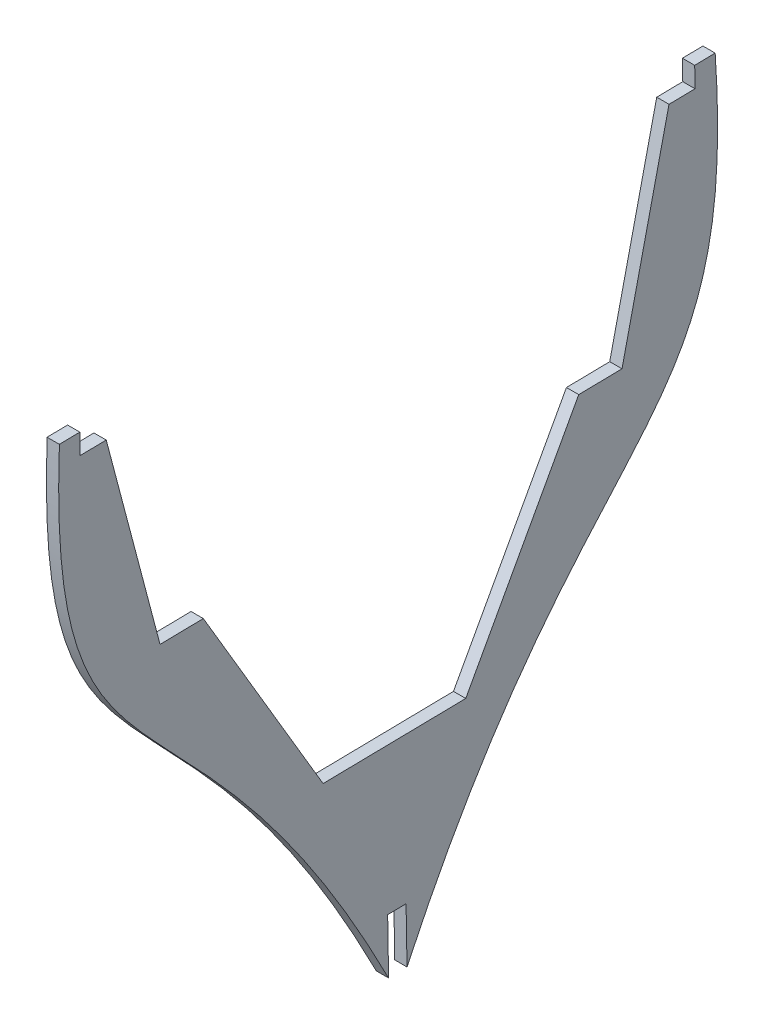
ISO-10303-21;
HEADER;
FILE_DESCRIPTION(('STEP AP214'),'2;1');
FILE_NAME('part.step','',(''),(''),'','','');
FILE_SCHEMA(('AUTOMOTIVE_DESIGN { 1 0 10303 214 1 1 1 1 }'));
ENDSEC;
DATA;
#1=APPLICATION_CONTEXT('core data for automotive mechanical design processes');
#2=APPLICATION_PROTOCOL_DEFINITION('international standard','automotive_design',2000,#1);
#3=PRODUCT_CONTEXT('',#1,'mechanical');
#4=PRODUCT('Part','Part','',(#3));
#5=PRODUCT_RELATED_PRODUCT_CATEGORY('part','',(#4));
#6=PRODUCT_DEFINITION_FORMATION('','',#4);
#7=PRODUCT_DEFINITION_CONTEXT('part definition',#1,'design');
#8=PRODUCT_DEFINITION('design','',#6,#7);
#9=PRODUCT_DEFINITION_SHAPE('','',#8);
#10=(LENGTH_UNIT() NAMED_UNIT(*) SI_UNIT(.MILLI.,.METRE.));
#11=(NAMED_UNIT(*) PLANE_ANGLE_UNIT() SI_UNIT($,.RADIAN.));
#12=(NAMED_UNIT(*) SI_UNIT($,.STERADIAN.) SOLID_ANGLE_UNIT());
#13=UNCERTAINTY_MEASURE_WITH_UNIT(LENGTH_MEASURE(1.E-05),#10,'distance_accuracy_value','');
#14=(GEOMETRIC_REPRESENTATION_CONTEXT(3) GLOBAL_UNCERTAINTY_ASSIGNED_CONTEXT((#13)) GLOBAL_UNIT_ASSIGNED_CONTEXT((#10,
#11,#12)) REPRESENTATION_CONTEXT('',''));
#15=CARTESIAN_POINT('',(0.,0.,0.));
#16=DIRECTION('',(0.,0.,1.));
#17=DIRECTION('',(1.,0.,0.));
#18=AXIS2_PLACEMENT_3D('',#15,#16,#17);
#19=CARTESIAN_POINT('',(6.,350.659764397002,166.024970344969));
#20=CARTESIAN_POINT('',(6.,182.415272885809,171.970871960082));
#21=CARTESIAN_POINT('',(6.,237.281542498073,100.687923251235));
#22=CARTESIAN_POINT('',(6.,35.2838539573811,0.586889824517354));
#23=B_SPLINE_CURVE_WITH_KNOTS('',3,(#19,#20,#21,#22),.UNSPECIFIED.,.F.,.F.,(4,4),(0.,1.),.UNSPECIFIED.);
#24=DIRECTION('',(-1.,0.,0.));
#25=VECTOR('',#24,1.);
#26=SURFACE_OF_LINEAR_EXTRUSION('',#23,#25);
#27=CARTESIAN_POINT('',(0.,350.659764397002,166.024970344969));
#28=CARTESIAN_POINT('',(0.,182.415272885809,171.970871960082));
#29=CARTESIAN_POINT('',(0.,237.281542498073,100.687923251235));
#30=CARTESIAN_POINT('',(0.,35.2838539573811,0.586889824517354));
#31=B_SPLINE_CURVE_WITH_KNOTS('',3,(#27,#28,#29,#30),.UNSPECIFIED.,.F.,.F.,(4,4),(0.,1.),.UNSPECIFIED.);
#32=CARTESIAN_POINT('',(0.,350.659764397002,166.024970344969));
#33=VERTEX_POINT('',#32);
#34=CARTESIAN_POINT('',(0.,44.5352413875151,5.24201669881402));
#35=VERTEX_POINT('',#34);
#36=EDGE_CURVE('E179',#33,#35,#31,.T.);
#37=ORIENTED_EDGE('',*,*,#36,.T.);
#38=DIRECTION('',(1.,0.,0.));
#39=VECTOR('',#38,1.);
#40=CARTESIAN_POINT('',(0.,44.5352413875151,5.24201669881402));
#41=LINE('',#40,#39);
#42=CARTESIAN_POINT('',(6.,44.5352413875151,5.24201669881402));
#43=VERTEX_POINT('',#42);
#44=EDGE_CURVE('E185',#35,#43,#41,.T.);
#45=ORIENTED_EDGE('',*,*,#44,.T.);
#46=CARTESIAN_POINT('',(6.,350.659764397002,166.024970344969));
#47=VERTEX_POINT('',#46);
#48=EDGE_CURVE('E219',#47,#43,#23,.T.);
#49=ORIENTED_EDGE('',*,*,#48,.F.);
#50=DIRECTION('',(-1.,0.,0.));
#51=VECTOR('',#50,1.);
#52=CARTESIAN_POINT('',(6.,350.659764397002,166.024970344969));
#53=LINE('',#52,#51);
#54=EDGE_CURVE('E175',#47,#33,#53,.T.);
#55=ORIENTED_EDGE('',*,*,#54,.T.);
#56=EDGE_LOOP('',(#37,#45,#49,#55));
#57=FACE_BOUND('',#56,.T.);
#58=ADVANCED_FACE('F33',(#57),#26,.F.);
#59=CARTESIAN_POINT('',(6.,35.2838539573811,0.586889824517354));
#60=CARTESIAN_POINT('',(6.,240.498916663988,-92.740818318363));
#61=CARTESIAN_POINT('',(6.,188.033695435773,-165.80905272476));
#62=CARTESIAN_POINT('',(6.,355.987370295187,-154.271038550099));
#63=B_SPLINE_CURVE_WITH_KNOTS('',3,(#59,#60,#61,#62),.UNSPECIFIED.,.F.,.F.,(4,4),(0.,1.),.UNSPECIFIED.);
#64=DIRECTION('',(-1.,0.,0.));
#65=VECTOR('',#64,1.);
#66=SURFACE_OF_LINEAR_EXTRUSION('',#63,#65);
#67=CARTESIAN_POINT('',(6.,44.6849418263344,-3.75798330118599));
#68=VERTEX_POINT('',#67);
#69=CARTESIAN_POINT('',(6.,355.987370295187,-154.271038550099));
#70=VERTEX_POINT('',#69);
#71=EDGE_CURVE('E116',#68,#70,#63,.T.);
#72=ORIENTED_EDGE('',*,*,#71,.F.);
#73=DIRECTION('',(1.,0.,0.));
#74=VECTOR('',#73,1.);
#75=CARTESIAN_POINT('',(0.,44.6849418263344,-3.75798330118599));
#76=LINE('',#75,#74);
#77=CARTESIAN_POINT('',(0.,44.6849418263344,-3.75798330118599));
#78=VERTEX_POINT('',#77);
#79=EDGE_CURVE('E311',#78,#68,#76,.T.);
#80=ORIENTED_EDGE('',*,*,#79,.F.);
#81=CARTESIAN_POINT('',(0.,35.2838539573811,0.586889824517354));
#82=CARTESIAN_POINT('',(0.,240.498916663988,-92.740818318363));
#83=CARTESIAN_POINT('',(0.,188.033695435773,-165.80905272476));
#84=CARTESIAN_POINT('',(0.,355.987370295187,-154.271038550099));
#85=B_SPLINE_CURVE_WITH_KNOTS('',3,(#81,#82,#83,#84),.UNSPECIFIED.,.F.,.F.,(4,4),(0.,1.),.UNSPECIFIED.);
#86=CARTESIAN_POINT('',(0.,355.987370295187,-154.271038550099));
#87=VERTEX_POINT('',#86);
#88=EDGE_CURVE('E184',#78,#87,#85,.T.);
#89=ORIENTED_EDGE('',*,*,#88,.T.);
#90=DIRECTION('',(-1.,0.,0.));
#91=VECTOR('',#90,1.);
#92=CARTESIAN_POINT('',(6.,355.987370295187,-154.271038550099));
#93=LINE('',#92,#91);
#94=EDGE_CURVE('E11',#70,#87,#93,.T.);
#95=ORIENTED_EDGE('',*,*,#94,.F.);
#96=EDGE_LOOP('',(#72,#80,#89,#95));
#97=FACE_BOUND('',#96,.T.);
#98=ADVANCED_FACE('F323',(#97),#66,.F.);
#99=CARTESIAN_POINT('',(6.,355.987370295187,-154.271038550099));
#100=DIRECTION('',(0.,-0.999861693998224,-0.0166310815944739));
#101=DIRECTION('',(0.,0.0166310815944739,-0.999861693998224));
#102=AXIS2_PLACEMENT_3D('',#99,#100,#101);
#103=PLANE('',#102);
#104=DIRECTION('',(0.,-0.0166310815944739,0.999861693998224));
#105=VECTOR('',#104,1.);
#106=CARTESIAN_POINT('',(0.,355.987370295187,-154.271038550099));
#107=LINE('',#106,#105);
#108=CARTESIAN_POINT('',(0.,355.821036474276,-144.271038550099));
#109=VERTEX_POINT('',#108);
#110=EDGE_CURVE('E192',#87,#109,#107,.T.);
#111=ORIENTED_EDGE('',*,*,#110,.T.);
#112=DIRECTION('',(-1.,0.,0.));
#113=VECTOR('',#112,1.);
#114=CARTESIAN_POINT('',(6.,355.821036474276,-144.271038550099));
#115=LINE('',#114,#113);
#116=CARTESIAN_POINT('',(6.,355.821036474276,-144.271038550099));
#117=VERTEX_POINT('',#116);
#118=EDGE_CURVE('E41',#117,#109,#115,.T.);
#119=ORIENTED_EDGE('',*,*,#118,.F.);
#120=DIRECTION('',(0.,-0.0166310815944739,0.999861693998224));
#121=VECTOR('',#120,1.);
#122=CARTESIAN_POINT('',(6.,355.987370295187,-154.271038550099));
#123=LINE('',#122,#121);
#124=EDGE_CURVE('E305',#70,#117,#123,.T.);
#125=ORIENTED_EDGE('',*,*,#124,.F.);
#126=ORIENTED_EDGE('',*,*,#94,.T.);
#127=EDGE_LOOP('',(#111,#119,#125,#126));
#128=FACE_BOUND('',#127,.T.);
#129=ADVANCED_FACE('F326',(#128),#103,.F.);
#130=CARTESIAN_POINT('',(6.,355.821036474276,-144.271038550099));
#131=DIRECTION('',(0.,0.0166310815944574,-0.999861693998224));
#132=DIRECTION('',(0.,0.999861693998224,0.0166310815944574));
#133=AXIS2_PLACEMENT_3D('',#130,#131,#132);
#134=PLANE('',#133);
#135=DIRECTION('',(0.,-0.999861693998224,-0.0166310815944574));
#136=VECTOR('',#135,1.);
#137=CARTESIAN_POINT('',(0.,355.821036474276,-144.271038550099));
#138=LINE('',#137,#136);
#139=CARTESIAN_POINT('',(0.,345.821036474277,-144.437372371009));
#140=VERTEX_POINT('',#139);
#141=EDGE_CURVE('E197',#109,#140,#138,.T.);
#142=ORIENTED_EDGE('',*,*,#141,.T.);
#143=DIRECTION('',(-1.,0.,0.));
#144=VECTOR('',#143,1.);
#145=CARTESIAN_POINT('',(6.,345.821036474277,-144.437372371009));
#146=LINE('',#145,#144);
#147=CARTESIAN_POINT('',(6.,345.821036474277,-144.437372371009));
#148=VERTEX_POINT('',#147);
#149=EDGE_CURVE('E244',#148,#140,#146,.T.);
#150=ORIENTED_EDGE('',*,*,#149,.F.);
#151=DIRECTION('',(0.,-0.999861693998224,-0.0166310815944574));
#152=VECTOR('',#151,1.);
#153=CARTESIAN_POINT('',(6.,355.821036474276,-144.271038550099));
#154=LINE('',#153,#152);
#155=EDGE_CURVE('E253',#117,#148,#154,.T.);
#156=ORIENTED_EDGE('',*,*,#155,.F.);
#157=ORIENTED_EDGE('',*,*,#118,.T.);
#158=EDGE_LOOP('',(#142,#150,#156,#157));
#159=FACE_BOUND('',#158,.T.);
#160=ADVANCED_FACE('F251',(#159),#134,.F.);
#161=CARTESIAN_POINT('',(6.,345.821036474277,-144.437372371009));
#162=DIRECTION('',(0.,-0.999861693998224,-0.0166310815944618));
#163=DIRECTION('',(0.,0.0166310815944618,-0.999861693998224));
#164=AXIS2_PLACEMENT_3D('',#161,#162,#163);
#165=PLANE('',#164);
#166=DIRECTION('',(0.,-0.0166310815944618,0.999861693998224));
#167=VECTOR('',#166,1.);
#168=CARTESIAN_POINT('',(0.,345.821036474277,-144.437372371009));
#169=LINE('',#168,#167);
#170=CARTESIAN_POINT('',(0.,345.60953200841,-131.72171029407));
#171=VERTEX_POINT('',#170);
#172=EDGE_CURVE('E199',#140,#171,#169,.T.);
#173=ORIENTED_EDGE('',*,*,#172,.T.);
#174=DIRECTION('',(-1.,0.,0.));
#175=VECTOR('',#174,1.);
#176=CARTESIAN_POINT('',(6.,345.60953200841,-131.72171029407));
#177=LINE('',#176,#175);
#178=CARTESIAN_POINT('',(6.,345.60953200841,-131.72171029407));
#179=VERTEX_POINT('',#178);
#180=EDGE_CURVE('E241',#179,#171,#177,.T.);
#181=ORIENTED_EDGE('',*,*,#180,.F.);
#182=DIRECTION('',(0.,-0.0166310815944618,0.999861693998224));
#183=VECTOR('',#182,1.);
#184=CARTESIAN_POINT('',(6.,345.821036474277,-144.437372371009));
#185=LINE('',#184,#183);
#186=EDGE_CURVE('E275',#148,#179,#185,.T.);
#187=ORIENTED_EDGE('',*,*,#186,.F.);
#188=ORIENTED_EDGE('',*,*,#149,.T.);
#189=EDGE_LOOP('',(#173,#181,#187,#188));
#190=FACE_BOUND('',#189,.T.);
#191=ADVANCED_FACE('F266',(#190),#165,.F.);
#192=CARTESIAN_POINT('',(6.,345.60953200841,-131.72171029407));
#193=DIRECTION('',(0.,-0.222907743790148,-0.974839544621773));
#194=DIRECTION('',(0.,0.974839544621773,-0.222907743790148));
#195=AXIS2_PLACEMENT_3D('',#192,#193,#194);
#196=PLANE('',#195);
#197=DIRECTION('',(0.,-0.974839544621773,0.222907743790148));
#198=VECTOR('',#197,1.);
#199=CARTESIAN_POINT('',(0.,345.60953200841,-131.72171029407));
#200=LINE('',#199,#198);
#201=CARTESIAN_POINT('',(0.,245.213854063886,-108.765138435284));
#202=VERTEX_POINT('',#201);
#203=EDGE_CURVE('E201',#171,#202,#200,.T.);
#204=ORIENTED_EDGE('',*,*,#203,.T.);
#205=DIRECTION('',(-1.,0.,0.));
#206=VECTOR('',#205,1.);
#207=CARTESIAN_POINT('',(6.,245.213854063886,-108.765138435284));
#208=LINE('',#207,#206);
#209=CARTESIAN_POINT('',(6.,245.213854063886,-108.765138435284));
#210=VERTEX_POINT('',#209);
#211=EDGE_CURVE('E238',#210,#202,#208,.T.);
#212=ORIENTED_EDGE('',*,*,#211,.F.);
#213=DIRECTION('',(0.,-0.974839544621773,0.222907743790148));
#214=VECTOR('',#213,1.);
#215=CARTESIAN_POINT('',(6.,345.60953200841,-131.72171029407));
#216=LINE('',#215,#214);
#217=EDGE_CURVE('E272',#179,#210,#216,.T.);
#218=ORIENTED_EDGE('',*,*,#217,.F.);
#219=ORIENTED_EDGE('',*,*,#180,.T.);
#220=EDGE_LOOP('',(#204,#212,#218,#219));
#221=FACE_BOUND('',#220,.T.);
#222=ADVANCED_FACE('F270',(#221),#196,.F.);
#223=CARTESIAN_POINT('',(6.,245.213854063886,-108.765138435284));
#224=DIRECTION('',(0.,-0.999861693998224,-0.0166310815944606));
#225=DIRECTION('',(0.,0.0166310815944606,-0.999861693998224));
#226=AXIS2_PLACEMENT_3D('',#223,#224,#225);
#227=PLANE('',#226);
#228=DIRECTION('',(0.,-0.0166310815944606,0.999861693998224));
#229=VECTOR('',#228,1.);
#230=CARTESIAN_POINT('',(0.,245.213854063886,-108.765138435284));
#231=LINE('',#230,#229);
#232=CARTESIAN_POINT('',(0.,244.86226254053,-87.6274334615373));
#233=VERTEX_POINT('',#232);
#234=EDGE_CURVE('E203',#202,#233,#231,.T.);
#235=ORIENTED_EDGE('',*,*,#234,.T.);
#236=DIRECTION('',(-1.,0.,0.));
#237=VECTOR('',#236,1.);
#238=CARTESIAN_POINT('',(6.,244.86226254053,-87.6274334615373));
#239=LINE('',#238,#237);
#240=CARTESIAN_POINT('',(6.,244.86226254053,-87.6274334615373));
#241=VERTEX_POINT('',#240);
#242=EDGE_CURVE('E235',#241,#233,#239,.T.);
#243=ORIENTED_EDGE('',*,*,#242,.F.);
#244=DIRECTION('',(0.,-0.0166310815944606,0.999861693998224));
#245=VECTOR('',#244,1.);
#246=CARTESIAN_POINT('',(6.,245.213854063886,-108.765138435284));
#247=LINE('',#246,#245);
#248=EDGE_CURVE('E274',#210,#241,#247,.T.);
#249=ORIENTED_EDGE('',*,*,#248,.F.);
#250=ORIENTED_EDGE('',*,*,#211,.T.);
#251=EDGE_LOOP('',(#235,#243,#249,#250));
#252=FACE_BOUND('',#251,.T.);
#253=ADVANCED_FACE('F336',(#252),#227,.F.);
#254=CARTESIAN_POINT('',(6.,244.86226254053,-87.6274334615373));
#255=DIRECTION('',(0.,-0.479673239748636,-0.877447196741233));
#256=DIRECTION('',(0.,0.877447196741233,-0.479673239748636));
#257=AXIS2_PLACEMENT_3D('',#254,#255,#256);
#258=PLANE('',#257);
#259=DIRECTION('',(0.,-0.877447196741233,0.479673239748636));
#260=VECTOR('',#259,1.);
#261=CARTESIAN_POINT('',(0.,244.86226254053,-87.6274334615373));
#262=LINE('',#261,#260);
#263=CARTESIAN_POINT('',(0.,143.930663492918,-32.4512504524804));
#264=VERTEX_POINT('',#263);
#265=EDGE_CURVE('E205',#233,#264,#262,.T.);
#266=ORIENTED_EDGE('',*,*,#265,.T.);
#267=DIRECTION('',(-1.,0.,0.));
#268=VECTOR('',#267,1.);
#269=CARTESIAN_POINT('',(6.,143.930663492918,-32.4512504524804));
#270=LINE('',#269,#268);
#271=CARTESIAN_POINT('',(6.,143.930663492918,-32.4512504524804));
#272=VERTEX_POINT('',#271);
#273=EDGE_CURVE('E232',#272,#264,#270,.T.);
#274=ORIENTED_EDGE('',*,*,#273,.F.);
#275=DIRECTION('',(0.,-0.877447196741233,0.479673239748636));
#276=VECTOR('',#275,1.);
#277=CARTESIAN_POINT('',(6.,244.86226254053,-87.6274334615373));
#278=LINE('',#277,#276);
#279=EDGE_CURVE('E277',#241,#272,#278,.T.);
#280=ORIENTED_EDGE('',*,*,#279,.F.);
#281=ORIENTED_EDGE('',*,*,#242,.T.);
#282=EDGE_LOOP('',(#266,#274,#280,#281));
#283=FACE_BOUND('',#282,.T.);
#284=ADVANCED_FACE('F339',(#283),#258,.F.);
#285=CARTESIAN_POINT('',(6.,142.771793599981,37.2200819677448));
#286=DIRECTION('',(0.,-0.999861693998224,-0.016631081594462));
#287=DIRECTION('',(0.,0.016631081594462,-0.999861693998224));
#288=AXIS2_PLACEMENT_3D('',#285,#286,#287);
#289=PLANE('',#288);
#290=DIRECTION('',(0.,-0.016631081594462,0.999861693998224));
#291=VECTOR('',#290,1.);
#292=CARTESIAN_POINT('',(0.,142.771793599981,37.2200819677448));
#293=LINE('',#292,#291);
#294=CARTESIAN_POINT('',(0.,142.771793599981,37.2200819677448));
#295=VERTEX_POINT('',#294);
#296=EDGE_CURVE('E207',#264,#295,#293,.T.);
#297=ORIENTED_EDGE('',*,*,#296,.T.);
#298=DIRECTION('',(-1.,0.,0.));
#299=VECTOR('',#298,1.);
#300=CARTESIAN_POINT('',(6.,142.771793599981,37.2200819677448));
#301=LINE('',#300,#299);
#302=CARTESIAN_POINT('',(6.,142.771793599981,37.2200819677448));
#303=VERTEX_POINT('',#302);
#304=EDGE_CURVE('E229',#303,#295,#301,.T.);
#305=ORIENTED_EDGE('',*,*,#304,.F.);
#306=DIRECTION('',(0.,-0.016631081594462,0.999861693998224));
#307=VECTOR('',#306,1.);
#308=CARTESIAN_POINT('',(6.,142.771793599981,37.2200819677448));
#309=LINE('',#308,#307);
#310=EDGE_CURVE('E283',#272,#303,#309,.T.);
#311=ORIENTED_EDGE('',*,*,#310,.F.);
#312=ORIENTED_EDGE('',*,*,#273,.T.);
#313=EDGE_LOOP('',(#297,#305,#311,#312));
#314=FACE_BOUND('',#313,.T.);
#315=ADVANCED_FACE('F343',(#314),#289,.F.);
#316=CARTESIAN_POINT('',(6.,241.812533352014,95.7224812956938));
#317=DIRECTION('',(0.,-0.508589646625238,0.861009042545788));
#318=DIRECTION('',(0.,-0.861009042545788,-0.508589646625238));
#319=AXIS2_PLACEMENT_3D('',#316,#317,#318);
#320=PLANE('',#319);
#321=DIRECTION('',(0.,0.861009042545788,0.508589646625238));
#322=VECTOR('',#321,1.);
#323=CARTESIAN_POINT('',(0.,241.812533352014,95.7224812956938));
#324=LINE('',#323,#322);
#325=CARTESIAN_POINT('',(0.,241.812533352014,95.7224812956938));
#326=VERTEX_POINT('',#325);
#327=EDGE_CURVE('E209',#295,#326,#324,.T.);
#328=ORIENTED_EDGE('',*,*,#327,.T.);
#329=DIRECTION('',(-1.,0.,0.));
#330=VECTOR('',#329,1.);
#331=CARTESIAN_POINT('',(6.,241.812533352014,95.7224812956938));
#332=LINE('',#331,#330);
#333=CARTESIAN_POINT('',(6.,241.812533352014,95.7224812956938));
#334=VERTEX_POINT('',#333);
#335=EDGE_CURVE('E226',#334,#326,#332,.T.);
#336=ORIENTED_EDGE('',*,*,#335,.F.);
#337=DIRECTION('',(0.,0.861009042545788,0.508589646625238));
#338=VECTOR('',#337,1.);
#339=CARTESIAN_POINT('',(6.,241.812533352014,95.7224812956938));
#340=LINE('',#339,#338);
#341=EDGE_CURVE('E285',#303,#334,#340,.T.);
#342=ORIENTED_EDGE('',*,*,#341,.F.);
#343=ORIENTED_EDGE('',*,*,#304,.T.);
#344=EDGE_LOOP('',(#328,#336,#342,#343));
#345=FACE_BOUND('',#344,.T.);
#346=ADVANCED_FACE('F347',(#345),#320,.F.);
#347=CARTESIAN_POINT('',(6.,241.460941828658,116.860186269441));
#348=DIRECTION('',(0.,-0.999861693998224,-0.0166310815944606));
#349=DIRECTION('',(0.,0.0166310815944606,-0.999861693998224));
#350=AXIS2_PLACEMENT_3D('',#347,#348,#349);
#351=PLANE('',#350);
#352=DIRECTION('',(0.,-0.0166310815944606,0.999861693998224));
#353=VECTOR('',#352,1.);
#354=CARTESIAN_POINT('',(0.,241.460941828658,116.860186269441));
#355=LINE('',#354,#353);
#356=CARTESIAN_POINT('',(0.,241.460941828658,116.860186269441));
#357=VERTEX_POINT('',#356);
#358=EDGE_CURVE('E211',#326,#357,#355,.T.);
#359=ORIENTED_EDGE('',*,*,#358,.T.);
#360=DIRECTION('',(-1.,0.,0.));
#361=VECTOR('',#360,1.);
#362=CARTESIAN_POINT('',(6.,241.460941828658,116.860186269441));
#363=LINE('',#362,#361);
#364=CARTESIAN_POINT('',(6.,241.460941828658,116.860186269441));
#365=VERTEX_POINT('',#364);
#366=EDGE_CURVE('E223',#365,#357,#363,.T.);
#367=ORIENTED_EDGE('',*,*,#366,.F.);
#368=DIRECTION('',(0.,-0.0166310815944606,0.999861693998224));
#369=VECTOR('',#368,1.);
#370=CARTESIAN_POINT('',(6.,241.460941828658,116.860186269441));
#371=LINE('',#370,#369);
#372=EDGE_CURVE('E287',#334,#365,#371,.T.);
#373=ORIENTED_EDGE('',*,*,#372,.F.);
#374=ORIENTED_EDGE('',*,*,#335,.T.);
#375=EDGE_LOOP('',(#359,#367,#373,#374));
#376=FACE_BOUND('',#375,.T.);
#377=ADVANCED_FACE('F293',(#376),#351,.F.);
#378=CARTESIAN_POINT('',(6.,341.037602683778,143.142974447119));
#379=DIRECTION('',(0.,-0.255205221809213,0.966886908982281));
#380=DIRECTION('',(0.,-0.966886908982281,-0.255205221809213));
#381=AXIS2_PLACEMENT_3D('',#378,#379,#380);
#382=PLANE('',#381);
#383=DIRECTION('',(0.,0.966886908982281,0.255205221809213));
#384=VECTOR('',#383,1.);
#385=CARTESIAN_POINT('',(0.,341.037602683778,143.142974447119));
#386=LINE('',#385,#384);
#387=CARTESIAN_POINT('',(0.,341.037602683778,143.142974447119));
#388=VERTEX_POINT('',#387);
#389=EDGE_CURVE('E213',#357,#388,#386,.T.);
#390=ORIENTED_EDGE('',*,*,#389,.T.);
#391=DIRECTION('',(-1.,0.,0.));
#392=VECTOR('',#391,1.);
#393=CARTESIAN_POINT('',(6.,341.037602683778,143.142974447119));
#394=LINE('',#393,#392);
#395=CARTESIAN_POINT('',(6.,341.037602683778,143.142974447119));
#396=VERTEX_POINT('',#395);
#397=EDGE_CURVE('E170',#396,#388,#394,.T.);
#398=ORIENTED_EDGE('',*,*,#397,.F.);
#399=DIRECTION('',(0.,0.966886908982281,0.255205221809213));
#400=VECTOR('',#399,1.);
#401=CARTESIAN_POINT('',(6.,341.037602683778,143.142974447119));
#402=LINE('',#401,#400);
#403=EDGE_CURVE('E158',#365,#396,#402,.T.);
#404=ORIENTED_EDGE('',*,*,#403,.F.);
#405=ORIENTED_EDGE('',*,*,#366,.T.);
#406=EDGE_LOOP('',(#390,#398,#404,#405));
#407=FACE_BOUND('',#406,.T.);
#408=ADVANCED_FACE('F297',(#407),#382,.F.);
#409=CARTESIAN_POINT('',(6.,340.826098217912,155.858636524058));
#410=DIRECTION('',(0.,-0.999861693998224,-0.0166310815944618));
#411=DIRECTION('',(0.,0.0166310815944618,-0.999861693998224));
#412=AXIS2_PLACEMENT_3D('',#409,#410,#411);
#413=PLANE('',#412);
#414=DIRECTION('',(0.,-0.0166310815944618,0.999861693998224));
#415=VECTOR('',#414,1.);
#416=CARTESIAN_POINT('',(0.,340.826098217912,155.858636524058));
#417=LINE('',#416,#415);
#418=CARTESIAN_POINT('',(0.,340.826098217912,155.858636524058));
#419=VERTEX_POINT('',#418);
#420=EDGE_CURVE('E167',#388,#419,#417,.T.);
#421=ORIENTED_EDGE('',*,*,#420,.T.);
#422=DIRECTION('',(-1.,0.,0.));
#423=VECTOR('',#422,1.);
#424=CARTESIAN_POINT('',(6.,340.826098217912,155.858636524058));
#425=LINE('',#424,#423);
#426=CARTESIAN_POINT('',(6.,340.826098217912,155.858636524058));
#427=VERTEX_POINT('',#426);
#428=EDGE_CURVE('E164',#427,#419,#425,.T.);
#429=ORIENTED_EDGE('',*,*,#428,.F.);
#430=DIRECTION('',(0.,-0.0166310815944618,0.999861693998224));
#431=VECTOR('',#430,1.);
#432=CARTESIAN_POINT('',(6.,340.826098217912,155.858636524058));
#433=LINE('',#432,#431);
#434=EDGE_CURVE('E151',#396,#427,#433,.T.);
#435=ORIENTED_EDGE('',*,*,#434,.F.);
#436=ORIENTED_EDGE('',*,*,#397,.T.);
#437=EDGE_LOOP('',(#421,#429,#435,#436));
#438=FACE_BOUND('',#437,.T.);
#439=ADVANCED_FACE('F165',(#438),#413,.F.);
#440=CARTESIAN_POINT('',(6.,350.826098217912,156.024970344969));
#441=DIRECTION('',(0.,-0.0166310815944628,0.999861693998224));
#442=DIRECTION('',(0.,-0.999861693998224,-0.0166310815944628));
#443=AXIS2_PLACEMENT_3D('',#440,#441,#442);
#444=PLANE('',#443);
#445=DIRECTION('',(0.,0.999861693998224,0.0166310815944628));
#446=VECTOR('',#445,1.);
#447=CARTESIAN_POINT('',(0.,350.826098217912,156.024970344969));
#448=LINE('',#447,#446);
#449=CARTESIAN_POINT('',(0.,350.826098217912,156.024970344969));
#450=VERTEX_POINT('',#449);
#451=EDGE_CURVE('E216',#419,#450,#448,.T.);
#452=ORIENTED_EDGE('',*,*,#451,.T.);
#453=DIRECTION('',(-1.,0.,0.));
#454=VECTOR('',#453,1.);
#455=CARTESIAN_POINT('',(6.,350.826098217912,156.024970344969));
#456=LINE('',#455,#454);
#457=CARTESIAN_POINT('',(6.,350.826098217912,156.024970344969));
#458=VERTEX_POINT('',#457);
#459=EDGE_CURVE('E171',#458,#450,#456,.T.);
#460=ORIENTED_EDGE('',*,*,#459,.F.);
#461=DIRECTION('',(0.,0.999861693998224,0.0166310815944628));
#462=VECTOR('',#461,1.);
#463=CARTESIAN_POINT('',(6.,350.826098217912,156.024970344969));
#464=LINE('',#463,#462);
#465=EDGE_CURVE('E155',#427,#458,#464,.T.);
#466=ORIENTED_EDGE('',*,*,#465,.F.);
#467=ORIENTED_EDGE('',*,*,#428,.T.);
#468=EDGE_LOOP('',(#452,#460,#466,#467));
#469=FACE_BOUND('',#468,.T.);
#470=ADVANCED_FACE('F173',(#469),#444,.F.);
#471=CARTESIAN_POINT('',(6.,350.659764397002,166.024970344969));
#472=DIRECTION('',(0.,-0.999861693998224,-0.0166310815944628));
#473=DIRECTION('',(0.,0.0166310815944628,-0.999861693998224));
#474=AXIS2_PLACEMENT_3D('',#471,#472,#473);
#475=PLANE('',#474);
#476=DIRECTION('',(0.,-0.0166310815944628,0.999861693998224));
#477=VECTOR('',#476,1.);
#478=CARTESIAN_POINT('',(0.,350.659764397002,166.024970344969));
#479=LINE('',#478,#477);
#480=EDGE_CURVE('E108',#450,#33,#479,.T.);
#481=ORIENTED_EDGE('',*,*,#480,.T.);
#482=ORIENTED_EDGE('',*,*,#54,.F.);
#483=DIRECTION('',(0.,-0.0166310815944628,0.999861693998224));
#484=VECTOR('',#483,1.);
#485=CARTESIAN_POINT('',(6.,350.659764397002,166.024970344969));
#486=LINE('',#485,#484);
#487=EDGE_CURVE('E57',#458,#47,#486,.T.);
#488=ORIENTED_EDGE('',*,*,#487,.F.);
#489=ORIENTED_EDGE('',*,*,#459,.T.);
#490=EDGE_LOOP('',(#481,#482,#488,#489));
#491=FACE_BOUND('',#490,.T.);
#492=ADVANCED_FACE('F299',(#491),#475,.F.);
#493=CARTESIAN_POINT('',(6.,205.629258063254,123.07353072543));
#494=DIRECTION('',(-1.,0.,0.));
#495=DIRECTION('',(0.,0.,1.));
#496=AXIS2_PLACEMENT_3D('',#493,#494,#495);
#497=PLANE('',#496);
#498=ORIENTED_EDGE('',*,*,#48,.T.);
#499=DIRECTION('',(0.,-0.999861693998224,-0.0166310815944619));
#500=VECTOR('',#499,1.);
#501=CARTESIAN_POINT('',(6.,44.5352413875151,5.24201669881402));
#502=LINE('',#501,#500);
#503=CARTESIAN_POINT('',(6.,71.5352413875151,5.69111801527196));
#504=VERTEX_POINT('',#503);
#505=EDGE_CURVE('E499',#504,#43,#502,.T.);
#506=ORIENTED_EDGE('',*,*,#505,.F.);
#507=DIRECTION('',(0.,-0.0166310815944622,0.999861693998224));
#508=VECTOR('',#507,1.);
#509=CARTESIAN_POINT('',(6.,71.5352413875151,5.69111801527196));
#510=LINE('',#509,#508);
#511=CARTESIAN_POINT('',(6.,71.6849418263344,-3.30888198472804));
#512=VERTEX_POINT('',#511);
#513=EDGE_CURVE('E507',#512,#504,#510,.T.);
#514=ORIENTED_EDGE('',*,*,#513,.F.);
#515=DIRECTION('',(0.,0.999861693998224,0.0166310815944622));
#516=VECTOR('',#515,1.);
#517=CARTESIAN_POINT('',(6.,71.6849418263344,-3.30888198472804));
#518=LINE('',#517,#516);
#519=EDGE_CURVE('E511',#68,#512,#518,.T.);
#520=ORIENTED_EDGE('',*,*,#519,.F.);
#521=ORIENTED_EDGE('',*,*,#71,.T.);
#522=ORIENTED_EDGE('',*,*,#124,.T.);
#523=ORIENTED_EDGE('',*,*,#155,.T.);
#524=ORIENTED_EDGE('',*,*,#186,.T.);
#525=ORIENTED_EDGE('',*,*,#217,.T.);
#526=ORIENTED_EDGE('',*,*,#248,.T.);
#527=ORIENTED_EDGE('',*,*,#279,.T.);
#528=ORIENTED_EDGE('',*,*,#310,.T.);
#529=ORIENTED_EDGE('',*,*,#341,.T.);
#530=ORIENTED_EDGE('',*,*,#372,.T.);
#531=ORIENTED_EDGE('',*,*,#403,.T.);
#532=ORIENTED_EDGE('',*,*,#434,.T.);
#533=ORIENTED_EDGE('',*,*,#465,.T.);
#534=ORIENTED_EDGE('',*,*,#487,.T.);
#535=EDGE_LOOP('',(#498,#506,#514,#520,#521,#522,#523,#524,#525,#526,#527,#528,#529,#530,#531,
#532,#533,#534));
#536=FACE_BOUND('',#535,.T.);
#537=ADVANCED_FACE('F153',(#536),#497,.F.);
#538=CARTESIAN_POINT('',(0.,205.629258063254,123.07353072543));
#539=DIRECTION('',(-1.,0.,0.));
#540=DIRECTION('',(0.,0.,1.));
#541=AXIS2_PLACEMENT_3D('',#538,#539,#540);
#542=PLANE('',#541);
#543=DIRECTION('',(0.,-0.999861693998224,-0.0166310815944619));
#544=VECTOR('',#543,1.);
#545=CARTESIAN_POINT('',(0.,44.5352413875151,5.24201669881402));
#546=LINE('',#545,#544);
#547=CARTESIAN_POINT('',(0.,71.5352413875151,5.69111801527196));
#548=VERTEX_POINT('',#547);
#549=EDGE_CURVE('E520',#548,#35,#546,.T.);
#550=ORIENTED_EDGE('',*,*,#549,.T.);
#551=ORIENTED_EDGE('',*,*,#36,.F.);
#552=ORIENTED_EDGE('',*,*,#480,.F.);
#553=ORIENTED_EDGE('',*,*,#451,.F.);
#554=ORIENTED_EDGE('',*,*,#420,.F.);
#555=ORIENTED_EDGE('',*,*,#389,.F.);
#556=ORIENTED_EDGE('',*,*,#358,.F.);
#557=ORIENTED_EDGE('',*,*,#327,.F.);
#558=ORIENTED_EDGE('',*,*,#296,.F.);
#559=ORIENTED_EDGE('',*,*,#265,.F.);
#560=ORIENTED_EDGE('',*,*,#234,.F.);
#561=ORIENTED_EDGE('',*,*,#203,.F.);
#562=ORIENTED_EDGE('',*,*,#172,.F.);
#563=ORIENTED_EDGE('',*,*,#141,.F.);
#564=ORIENTED_EDGE('',*,*,#110,.F.);
#565=ORIENTED_EDGE('',*,*,#88,.F.);
#566=DIRECTION('',(0.,0.999861693998224,0.0166310815944622));
#567=VECTOR('',#566,1.);
#568=CARTESIAN_POINT('',(0.,71.6849418263344,-3.30888198472804));
#569=LINE('',#568,#567);
#570=CARTESIAN_POINT('',(0.,71.6849418263345,-3.30888198472805));
#571=VERTEX_POINT('',#570);
#572=EDGE_CURVE('E506',#78,#571,#569,.T.);
#573=ORIENTED_EDGE('',*,*,#572,.T.);
#574=DIRECTION('',(0.,-0.0166310815944622,0.999861693998224));
#575=VECTOR('',#574,1.);
#576=CARTESIAN_POINT('',(0.,71.5352413875151,5.69111801527196));
#577=LINE('',#576,#575);
#578=EDGE_CURVE('E48',#571,#548,#577,.T.);
#579=ORIENTED_EDGE('',*,*,#578,.T.);
#580=EDGE_LOOP('',(#550,#551,#552,#553,#554,#555,#556,#557,#558,#559,#560,#561,#562,#563,#564,
#565,#573,#579));
#581=FACE_BOUND('',#580,.T.);
#582=ADVANCED_FACE('F260',(#581),#542,.T.);
#583=CARTESIAN_POINT('',(0.,44.5352413875151,5.24201669881402));
#584=DIRECTION('',(0.,-0.0166310815944619,0.999861693998224));
#585=DIRECTION('',(0.,-0.999861693998224,-0.0166310815944619));
#586=AXIS2_PLACEMENT_3D('',#583,#584,#585);
#587=PLANE('',#586);
#588=ORIENTED_EDGE('',*,*,#505,.T.);
#589=ORIENTED_EDGE('',*,*,#44,.F.);
#590=ORIENTED_EDGE('',*,*,#549,.F.);
#591=DIRECTION('',(1.,0.,0.));
#592=VECTOR('',#591,1.);
#593=CARTESIAN_POINT('',(0.,71.5352413875151,5.69111801527196));
#594=LINE('',#593,#592);
#595=EDGE_CURVE('E502',#548,#504,#594,.T.);
#596=ORIENTED_EDGE('',*,*,#595,.T.);
#597=EDGE_LOOP('',(#588,#589,#590,#596));
#598=FACE_BOUND('',#597,.T.);
#599=ADVANCED_FACE('F364',(#598),#587,.F.);
#600=CARTESIAN_POINT('',(0.,71.5352413875151,5.69111801527196));
#601=DIRECTION('',(0.,0.999861693998224,0.0166310815944622));
#602=DIRECTION('',(0.,-0.0166310815944622,0.999861693998224));
#603=AXIS2_PLACEMENT_3D('',#600,#601,#602);
#604=PLANE('',#603);
#605=ORIENTED_EDGE('',*,*,#513,.T.);
#606=ORIENTED_EDGE('',*,*,#595,.F.);
#607=ORIENTED_EDGE('',*,*,#578,.F.);
#608=DIRECTION('',(1.,0.,0.));
#609=VECTOR('',#608,1.);
#610=CARTESIAN_POINT('',(0.,71.6849418263344,-3.30888198472804));
#611=LINE('',#610,#609);
#612=EDGE_CURVE('E516',#571,#512,#611,.T.);
#613=ORIENTED_EDGE('',*,*,#612,.T.);
#614=EDGE_LOOP('',(#605,#606,#607,#613));
#615=FACE_BOUND('',#614,.T.);
#616=ADVANCED_FACE('F370',(#615),#604,.F.);
#617=CARTESIAN_POINT('',(0.,71.6849418263344,-3.30888198472804));
#618=DIRECTION('',(0.,0.0166310815944622,-0.999861693998224));
#619=DIRECTION('',(0.,0.999861693998224,0.0166310815944622));
#620=AXIS2_PLACEMENT_3D('',#617,#618,#619);
#621=PLANE('',#620);
#622=ORIENTED_EDGE('',*,*,#519,.T.);
#623=ORIENTED_EDGE('',*,*,#612,.F.);
#624=ORIENTED_EDGE('',*,*,#572,.F.);
#625=ORIENTED_EDGE('',*,*,#79,.T.);
#626=EDGE_LOOP('',(#622,#623,#624,#625));
#627=FACE_BOUND('',#626,.T.);
#628=ADVANCED_FACE('F367',(#627),#621,.F.);
#629=CLOSED_SHELL('',(#58,#98,#129,#160,#191,#222,#253,#284,#315,#346,#377,#408,#439,#470,#492,
#537,#582,#599,#616,#628));
#630=MANIFOLD_SOLID_BREP('B2',#629);
#631=ADVANCED_BREP_SHAPE_REPRESENTATION('',(#18,#630),#14);
#632=SHAPE_DEFINITION_REPRESENTATION(#9,#631);
ENDSEC;
END-ISO-10303-21;
